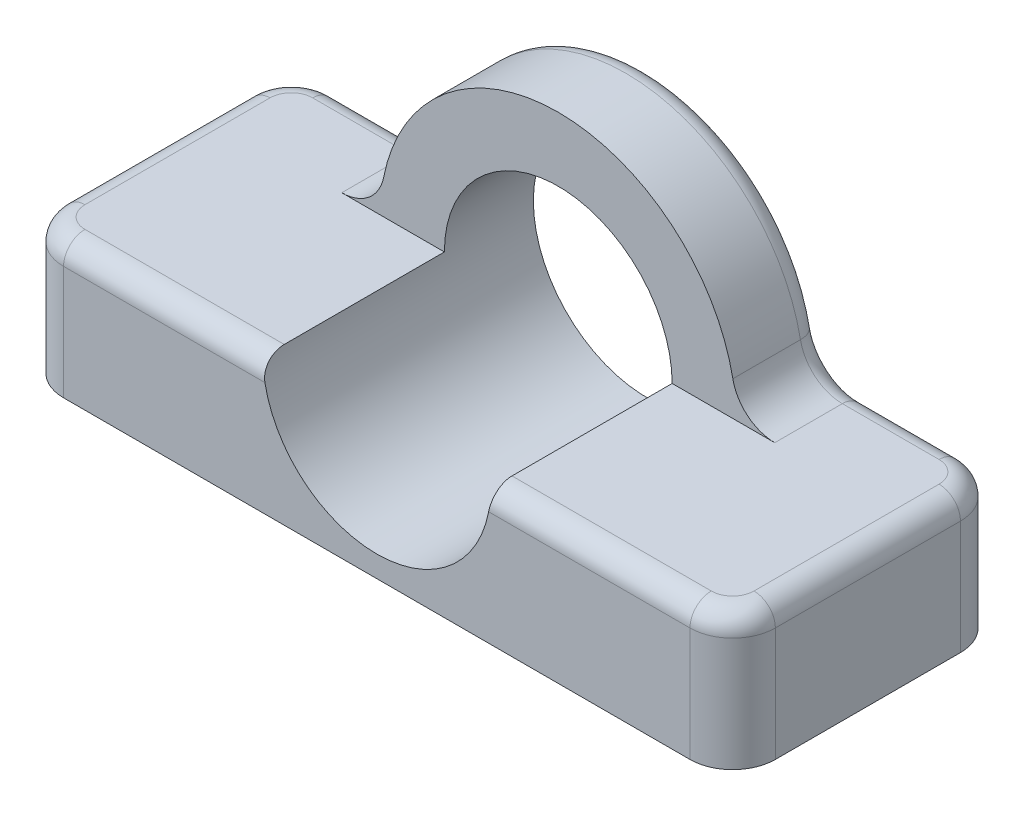
ISO-10303-21;
HEADER;
FILE_DESCRIPTION(('STEP AP214'),'2;1');
FILE_NAME('part.step','',(''),(''),'','','');
FILE_SCHEMA(('AUTOMOTIVE_DESIGN { 1 0 10303 214 1 1 1 1 }'));
ENDSEC;
DATA;
#1=APPLICATION_CONTEXT('core data for automotive mechanical design processes');
#2=APPLICATION_PROTOCOL_DEFINITION('international standard','automotive_design',2000,#1);
#3=PRODUCT_CONTEXT('',#1,'mechanical');
#4=PRODUCT('Part','Part','',(#3));
#5=PRODUCT_RELATED_PRODUCT_CATEGORY('part','',(#4));
#6=PRODUCT_DEFINITION_FORMATION('','',#4);
#7=PRODUCT_DEFINITION_CONTEXT('part definition',#1,'design');
#8=PRODUCT_DEFINITION('design','',#6,#7);
#9=PRODUCT_DEFINITION_SHAPE('','',#8);
#10=(LENGTH_UNIT() NAMED_UNIT(*) SI_UNIT(.MILLI.,.METRE.));
#11=(NAMED_UNIT(*) PLANE_ANGLE_UNIT() SI_UNIT($,.RADIAN.));
#12=(NAMED_UNIT(*) SI_UNIT($,.STERADIAN.) SOLID_ANGLE_UNIT());
#13=UNCERTAINTY_MEASURE_WITH_UNIT(LENGTH_MEASURE(1.E-05),#10,'distance_accuracy_value','');
#14=(GEOMETRIC_REPRESENTATION_CONTEXT(3) GLOBAL_UNCERTAINTY_ASSIGNED_CONTEXT((#13)) GLOBAL_UNIT_ASSIGNED_CONTEXT((#10,
#11,#12)) REPRESENTATION_CONTEXT('',''));
#15=CARTESIAN_POINT('',(0.,0.,0.));
#16=DIRECTION('',(0.,0.,1.));
#17=DIRECTION('',(1.,0.,0.));
#18=AXIS2_PLACEMENT_3D('',#15,#16,#17);
#19=CARTESIAN_POINT('',(0.,19.,-38.));
#20=DIRECTION('',(0.,-1.,0.));
#21=DIRECTION('',(0.,0.,-1.));
#22=AXIS2_PLACEMENT_3D('',#19,#20,#21);
#23=PLANE('',#22);
#24=DIRECTION('',(0.,0.,-1.));
#25=VECTOR('',#24,1.);
#26=CARTESIAN_POINT('',(19.5861873485089,19.,-38.));
#27=LINE('',#26,#25);
#28=CARTESIAN_POINT('',(19.5861873485089,19.,-25.5));
#29=VERTEX_POINT('',#28);
#30=CARTESIAN_POINT('',(19.5861873485089,19.,-35.));
#31=VERTEX_POINT('',#30);
#32=EDGE_CURVE('E240',#29,#31,#27,.T.);
#33=ORIENTED_EDGE('',*,*,#32,.T.);
#34=DIRECTION('',(-1.,0.,0.));
#35=VECTOR('',#34,1.);
#36=CARTESIAN_POINT('',(0.,19.,-35.));
#37=LINE('',#36,#35);
#38=CARTESIAN_POINT('',(6.,19.,-35.));
#39=VERTEX_POINT('',#38);
#40=EDGE_CURVE('E643',#31,#39,#37,.T.);
#41=ORIENTED_EDGE('',*,*,#40,.T.);
#42=CARTESIAN_POINT('',(6.,19.,-32.));
#43=DIRECTION('',(0.,-1.,0.));
#44=DIRECTION('',(0.,0.,-1.));
#45=AXIS2_PLACEMENT_3D('',#42,#43,#44);
#46=CIRCLE('',#45,3.);
#47=CARTESIAN_POINT('',(3.,19.,-32.));
#48=VERTEX_POINT('',#47);
#49=EDGE_CURVE('E645',#39,#48,#46,.F.);
#50=ORIENTED_EDGE('',*,*,#49,.T.);
#51=DIRECTION('',(0.,0.,1.));
#52=VECTOR('',#51,1.);
#53=CARTESIAN_POINT('',(3.,19.,-38.));
#54=LINE('',#53,#52);
#55=CARTESIAN_POINT('',(3.,19.,-6.));
#56=VERTEX_POINT('',#55);
#57=EDGE_CURVE('E647',#48,#56,#54,.T.);
#58=ORIENTED_EDGE('',*,*,#57,.T.);
#59=CARTESIAN_POINT('',(6.,19.,-6.));
#60=DIRECTION('',(0.,-1.,0.));
#61=DIRECTION('',(0.,0.,-1.));
#62=AXIS2_PLACEMENT_3D('',#59,#60,#61);
#63=CIRCLE('',#62,3.);
#64=CARTESIAN_POINT('',(6.,19.,-3.));
#65=VERTEX_POINT('',#64);
#66=EDGE_CURVE('E601',#56,#65,#63,.F.);
#67=ORIENTED_EDGE('',*,*,#66,.T.);
#68=DIRECTION('',(1.,0.,0.));
#69=VECTOR('',#68,1.);
#70=CARTESIAN_POINT('',(0.,19.,-3.));
#71=LINE('',#70,#69);
#72=CARTESIAN_POINT('',(34.,19.,-3.));
#73=VERTEX_POINT('',#72);
#74=EDGE_CURVE('E197',#65,#73,#71,.T.);
#75=ORIENTED_EDGE('',*,*,#74,.T.);
#76=DIRECTION('',(0.,0.,-1.));
#77=VECTOR('',#76,1.);
#78=CARTESIAN_POINT('',(34.,19.,0.));
#79=LINE('',#78,#77);
#80=CARTESIAN_POINT('',(34.,19.,-25.5));
#81=VERTEX_POINT('',#80);
#82=EDGE_CURVE('E190',#73,#81,#79,.T.);
#83=ORIENTED_EDGE('',*,*,#82,.T.);
#84=DIRECTION('',(-1.,0.,0.));
#85=VECTOR('',#84,1.);
#86=CARTESIAN_POINT('',(25.,19.,-25.5));
#87=LINE('',#86,#85);
#88=EDGE_CURVE('E194',#81,#29,#87,.T.);
#89=ORIENTED_EDGE('',*,*,#88,.T.);
#90=EDGE_LOOP('',(#33,#41,#50,#58,#67,#75,#83,#89));
#91=FACE_BOUND('',#90,.T.);
#92=ADVANCED_FACE('F46',(#91),#23,.F.);
#93=CARTESIAN_POINT('',(0.,19.,0.));
#94=DIRECTION('',(1.,0.,0.));
#95=DIRECTION('',(0.,0.,-1.));
#96=AXIS2_PLACEMENT_3D('',#93,#94,#95);
#97=PLANE('',#96);
#98=DIRECTION('',(0.,-1.,0.));
#99=VECTOR('',#98,1.);
#100=CARTESIAN_POINT('',(0.,19.,-6.));
#101=LINE('',#100,#99);
#102=CARTESIAN_POINT('',(0.,0.,-6.));
#103=VERTEX_POINT('',#102);
#104=CARTESIAN_POINT('',(0.,16.,-6.));
#105=VERTEX_POINT('',#104);
#106=EDGE_CURVE('E269',#103,#105,#101,.F.);
#107=ORIENTED_EDGE('',*,*,#106,.T.);
#108=DIRECTION('',(0.,0.,1.));
#109=VECTOR('',#108,1.);
#110=CARTESIAN_POINT('',(0.,16.,0.));
#111=LINE('',#110,#109);
#112=CARTESIAN_POINT('',(0.,16.,-32.));
#113=VERTEX_POINT('',#112);
#114=EDGE_CURVE('E56',#105,#113,#111,.F.);
#115=ORIENTED_EDGE('',*,*,#114,.T.);
#116=DIRECTION('',(0.,-1.,0.));
#117=VECTOR('',#116,1.);
#118=CARTESIAN_POINT('',(0.,19.,-32.));
#119=LINE('',#118,#117);
#120=CARTESIAN_POINT('',(0.,0.,-32.));
#121=VERTEX_POINT('',#120);
#122=EDGE_CURVE('E271',#113,#121,#119,.T.);
#123=ORIENTED_EDGE('',*,*,#122,.T.);
#124=DIRECTION('',(0.,0.,1.));
#125=VECTOR('',#124,1.);
#126=CARTESIAN_POINT('',(0.,0.,0.));
#127=LINE('',#126,#125);
#128=EDGE_CURVE('E220',#121,#103,#127,.T.);
#129=ORIENTED_EDGE('',*,*,#128,.T.);
#130=EDGE_LOOP('',(#107,#115,#123,#129));
#131=FACE_BOUND('',#130,.T.);
#132=ADVANCED_FACE('F335',(#131),#97,.F.);
#133=CARTESIAN_POINT('',(0.,19.,0.));
#134=DIRECTION('',(0.,0.,-1.));
#135=DIRECTION('',(-1.,0.,0.));
#136=AXIS2_PLACEMENT_3D('',#133,#134,#135);
#137=PLANE('',#136);
#138=DIRECTION('',(0.,-1.,0.));
#139=VECTOR('',#138,1.);
#140=CARTESIAN_POINT('',(94.,19.,0.));
#141=LINE('',#140,#139);
#142=CARTESIAN_POINT('',(94.,0.,0.));
#143=VERTEX_POINT('',#142);
#144=CARTESIAN_POINT('',(94.,16.,0.));
#145=VERTEX_POINT('',#144);
#146=EDGE_CURVE('E261',#143,#145,#141,.F.);
#147=ORIENTED_EDGE('',*,*,#146,.T.);
#148=DIRECTION('',(1.,0.,0.));
#149=VECTOR('',#148,1.);
#150=CARTESIAN_POINT('',(0.,16.,0.));
#151=LINE('',#150,#149);
#152=CARTESIAN_POINT('',(65.7162336455017,16.,0.));
#153=VERTEX_POINT('',#152);
#154=EDGE_CURVE('E286',#145,#153,#151,.F.);
#155=ORIENTED_EDGE('',*,*,#154,.T.);
#156=CARTESIAN_POINT('',(50.,19.,0.));
#157=DIRECTION('',(0.,0.,-1.));
#158=DIRECTION('',(-1.,0.,0.));
#159=AXIS2_PLACEMENT_3D('',#156,#157,#158);
#160=CIRCLE('',#159,16.);
#161=CARTESIAN_POINT('',(34.2837663544983,16.,0.));
#162=VERTEX_POINT('',#161);
#163=EDGE_CURVE('E607',#153,#162,#160,.T.);
#164=ORIENTED_EDGE('',*,*,#163,.T.);
#165=DIRECTION('',(1.,0.,0.));
#166=VECTOR('',#165,1.);
#167=CARTESIAN_POINT('',(0.,16.,0.));
#168=LINE('',#167,#166);
#169=CARTESIAN_POINT('',(6.,16.,0.));
#170=VERTEX_POINT('',#169);
#171=EDGE_CURVE('E284',#162,#170,#168,.F.);
#172=ORIENTED_EDGE('',*,*,#171,.T.);
#173=DIRECTION('',(0.,-1.,0.));
#174=VECTOR('',#173,1.);
#175=CARTESIAN_POINT('',(6.,19.,0.));
#176=LINE('',#175,#174);
#177=CARTESIAN_POINT('',(6.,0.,0.));
#178=VERTEX_POINT('',#177);
#179=EDGE_CURVE('E259',#170,#178,#176,.T.);
#180=ORIENTED_EDGE('',*,*,#179,.T.);
#181=DIRECTION('',(1.,0.,0.));
#182=VECTOR('',#181,1.);
#183=CARTESIAN_POINT('',(0.,0.,0.));
#184=LINE('',#183,#182);
#185=EDGE_CURVE('E226',#178,#143,#184,.T.);
#186=ORIENTED_EDGE('',*,*,#185,.T.);
#187=EDGE_LOOP('',(#147,#155,#164,#172,#180,#186));
#188=FACE_BOUND('',#187,.T.);
#189=ADVANCED_FACE('F331',(#188),#137,.F.);
#190=CARTESIAN_POINT('',(100.,19.,0.));
#191=DIRECTION('',(-1.,0.,0.));
#192=DIRECTION('',(0.,0.,1.));
#193=AXIS2_PLACEMENT_3D('',#190,#191,#192);
#194=PLANE('',#193);
#195=DIRECTION('',(0.,-1.,0.));
#196=VECTOR('',#195,1.);
#197=CARTESIAN_POINT('',(100.,19.,-32.));
#198=LINE('',#197,#196);
#199=CARTESIAN_POINT('',(100.,0.,-32.));
#200=VERTEX_POINT('',#199);
#201=CARTESIAN_POINT('',(100.,16.,-32.));
#202=VERTEX_POINT('',#201);
#203=EDGE_CURVE('E211',#200,#202,#198,.F.);
#204=ORIENTED_EDGE('',*,*,#203,.T.);
#205=DIRECTION('',(0.,0.,-1.));
#206=VECTOR('',#205,1.);
#207=CARTESIAN_POINT('',(100.,16.,0.));
#208=LINE('',#207,#206);
#209=CARTESIAN_POINT('',(100.,16.,-6.));
#210=VERTEX_POINT('',#209);
#211=EDGE_CURVE('E669',#202,#210,#208,.F.);
#212=ORIENTED_EDGE('',*,*,#211,.T.);
#213=DIRECTION('',(0.,-1.,0.));
#214=VECTOR('',#213,1.);
#215=CARTESIAN_POINT('',(100.,19.,-6.));
#216=LINE('',#215,#214);
#217=CARTESIAN_POINT('',(100.,0.,-6.));
#218=VERTEX_POINT('',#217);
#219=EDGE_CURVE('E249',#210,#218,#216,.T.);
#220=ORIENTED_EDGE('',*,*,#219,.T.);
#221=DIRECTION('',(0.,0.,-1.));
#222=VECTOR('',#221,1.);
#223=CARTESIAN_POINT('',(100.,0.,0.));
#224=LINE('',#223,#222);
#225=EDGE_CURVE('E229',#218,#200,#224,.T.);
#226=ORIENTED_EDGE('',*,*,#225,.T.);
#227=EDGE_LOOP('',(#204,#212,#220,#226));
#228=FACE_BOUND('',#227,.T.);
#229=ADVANCED_FACE('F327',(#228),#194,.F.);
#230=CARTESIAN_POINT('',(0.,19.,-38.));
#231=DIRECTION('',(0.,0.,1.));
#232=DIRECTION('',(1.,0.,0.));
#233=AXIS2_PLACEMENT_3D('',#230,#231,#232);
#234=PLANE('',#233);
#235=CARTESIAN_POINT('',(50.,19.,-38.));
#236=DIRECTION('',(0.,0.,-1.));
#237=DIRECTION('',(-1.,0.,0.));
#238=AXIS2_PLACEMENT_3D('',#235,#236,#237);
#239=CIRCLE('',#238,16.);
#240=CARTESIAN_POINT('',(34.,19.,-38.));
#241=VERTEX_POINT('',#240);
#242=EDGE_CURVE('E604',#241,#241,#239,.T.);
#243=ORIENTED_EDGE('',*,*,#242,.F.);
#244=EDGE_LOOP('',(#243));
#245=FACE_BOUND('',#244,.T.);
#246=CARTESIAN_POINT('',(80.4138126514911,25.,-38.));
#247=DIRECTION('',(0.,0.,1.));
#248=DIRECTION('',(1.,0.,0.));
#249=AXIS2_PLACEMENT_3D('',#246,#247,#248);
#250=CIRCLE('',#249,9.);
#251=CARTESIAN_POINT('',(71.5839960752518,23.258064516129,-38.));
#252=VERTEX_POINT('',#251);
#253=CARTESIAN_POINT('',(80.4138126514911,16.,-38.));
#254=VERTEX_POINT('',#253);
#255=EDGE_CURVE('E659',#252,#254,#250,.T.);
#256=ORIENTED_EDGE('',*,*,#255,.T.);
#257=DIRECTION('',(-1.,0.,0.));
#258=VECTOR('',#257,1.);
#259=CARTESIAN_POINT('',(0.,16.,-38.));
#260=LINE('',#259,#258);
#261=CARTESIAN_POINT('',(94.,16.,-38.));
#262=VERTEX_POINT('',#261);
#263=EDGE_CURVE('E657',#254,#262,#260,.F.);
#264=ORIENTED_EDGE('',*,*,#263,.T.);
#265=DIRECTION('',(0.,-1.,0.));
#266=VECTOR('',#265,1.);
#267=CARTESIAN_POINT('',(94.,19.,-38.));
#268=LINE('',#267,#266);
#269=CARTESIAN_POINT('',(94.,0.,-38.));
#270=VERTEX_POINT('',#269);
#271=EDGE_CURVE('E267',#262,#270,#268,.T.);
#272=ORIENTED_EDGE('',*,*,#271,.T.);
#273=DIRECTION('',(-1.,0.,0.));
#274=VECTOR('',#273,1.);
#275=CARTESIAN_POINT('',(0.,0.,-38.));
#276=LINE('',#275,#274);
#277=CARTESIAN_POINT('',(6.,0.,-38.));
#278=VERTEX_POINT('',#277);
#279=EDGE_CURVE('E232',#270,#278,#276,.T.);
#280=ORIENTED_EDGE('',*,*,#279,.T.);
#281=DIRECTION('',(0.,-1.,0.));
#282=VECTOR('',#281,1.);
#283=CARTESIAN_POINT('',(6.,19.,-38.));
#284=LINE('',#283,#282);
#285=CARTESIAN_POINT('',(6.,16.,-38.));
#286=VERTEX_POINT('',#285);
#287=EDGE_CURVE('E264',#278,#286,#284,.F.);
#288=ORIENTED_EDGE('',*,*,#287,.T.);
#289=DIRECTION('',(-1.,0.,0.));
#290=VECTOR('',#289,1.);
#291=CARTESIAN_POINT('',(0.,16.,-38.));
#292=LINE('',#291,#290);
#293=CARTESIAN_POINT('',(19.5861873485089,16.,-38.));
#294=VERTEX_POINT('',#293);
#295=EDGE_CURVE('E665',#286,#294,#292,.F.);
#296=ORIENTED_EDGE('',*,*,#295,.T.);
#297=CARTESIAN_POINT('',(19.5861873485089,25.,-38.));
#298=DIRECTION('',(0.,0.,1.));
#299=DIRECTION('',(1.,0.,0.));
#300=AXIS2_PLACEMENT_3D('',#297,#298,#299);
#301=CIRCLE('',#300,9.);
#302=CARTESIAN_POINT('',(28.4160039247482,23.258064516129,-38.));
#303=VERTEX_POINT('',#302);
#304=EDGE_CURVE('E663',#294,#303,#301,.T.);
#305=ORIENTED_EDGE('',*,*,#304,.T.);
#306=CARTESIAN_POINT('',(50.,19.,-38.));
#307=DIRECTION('',(0.,0.,1.));
#308=DIRECTION('',(1.,0.,0.));
#309=AXIS2_PLACEMENT_3D('',#306,#307,#308);
#310=CIRCLE('',#309,22.);
#311=EDGE_CURVE('E661',#303,#252,#310,.F.);
#312=ORIENTED_EDGE('',*,*,#311,.T.);
#313=EDGE_LOOP('',(#256,#264,#272,#280,#288,#296,#305,#312));
#314=FACE_BOUND('',#313,.T.);
#315=ADVANCED_FACE('F320',(#245,#314),#234,.F.);
#316=DIRECTION('',(0.,0.,-1.));
#317=VECTOR('',#316,1.);
#318=CARTESIAN_POINT('',(66.,19.,0.));
#319=LINE('',#318,#317);
#320=CARTESIAN_POINT('',(66.,19.,-25.5));
#321=VERTEX_POINT('',#320);
#322=CARTESIAN_POINT('',(66.,19.,-3.));
#323=VERTEX_POINT('',#322);
#324=EDGE_CURVE('E201',#321,#323,#319,.F.);
#325=ORIENTED_EDGE('',*,*,#324,.T.);
#326=DIRECTION('',(1.,0.,0.));
#327=VECTOR('',#326,1.);
#328=CARTESIAN_POINT('',(0.,19.,-3.));
#329=LINE('',#328,#327);
#330=CARTESIAN_POINT('',(94.,19.,-3.));
#331=VERTEX_POINT('',#330);
#332=EDGE_CURVE('E281',#323,#331,#329,.T.);
#333=ORIENTED_EDGE('',*,*,#332,.T.);
#334=CARTESIAN_POINT('',(94.,19.,-6.));
#335=DIRECTION('',(0.,-1.,0.));
#336=DIRECTION('',(0.,0.,-1.));
#337=AXIS2_PLACEMENT_3D('',#334,#335,#336);
#338=CIRCLE('',#337,3.);
#339=CARTESIAN_POINT('',(97.,19.,-6.));
#340=VERTEX_POINT('',#339);
#341=EDGE_CURVE('E279',#331,#340,#338,.F.);
#342=ORIENTED_EDGE('',*,*,#341,.T.);
#343=DIRECTION('',(0.,0.,-1.));
#344=VECTOR('',#343,1.);
#345=CARTESIAN_POINT('',(97.,19.,-38.));
#346=LINE('',#345,#344);
#347=CARTESIAN_POINT('',(97.,19.,-32.));
#348=VERTEX_POINT('',#347);
#349=EDGE_CURVE('E277',#340,#348,#346,.T.);
#350=ORIENTED_EDGE('',*,*,#349,.T.);
#351=CARTESIAN_POINT('',(94.,19.,-32.));
#352=DIRECTION('',(0.,-1.,0.));
#353=DIRECTION('',(0.,0.,-1.));
#354=AXIS2_PLACEMENT_3D('',#351,#352,#353);
#355=CIRCLE('',#354,3.);
#356=CARTESIAN_POINT('',(94.,19.,-35.));
#357=VERTEX_POINT('',#356);
#358=EDGE_CURVE('E275',#348,#357,#355,.F.);
#359=ORIENTED_EDGE('',*,*,#358,.T.);
#360=DIRECTION('',(-1.,0.,0.));
#361=VECTOR('',#360,1.);
#362=CARTESIAN_POINT('',(0.,19.,-35.));
#363=LINE('',#362,#361);
#364=CARTESIAN_POINT('',(80.4138126514911,19.,-35.));
#365=VERTEX_POINT('',#364);
#366=EDGE_CURVE('E273',#357,#365,#363,.T.);
#367=ORIENTED_EDGE('',*,*,#366,.T.);
#368=DIRECTION('',(0.,0.,-1.));
#369=VECTOR('',#368,1.);
#370=CARTESIAN_POINT('',(80.4138126514911,19.,-38.));
#371=LINE('',#370,#369);
#372=CARTESIAN_POINT('',(80.4138126514911,19.,-25.5));
#373=VERTEX_POINT('',#372);
#374=EDGE_CURVE('E242',#365,#373,#371,.F.);
#375=ORIENTED_EDGE('',*,*,#374,.T.);
#376=EDGE_CURVE('E218',#373,#321,#87,.T.);
#377=ORIENTED_EDGE('',*,*,#376,.T.);
#378=EDGE_LOOP('',(#325,#333,#342,#350,#359,#367,#375,#377));
#379=FACE_BOUND('',#378,.T.);
#380=ADVANCED_FACE('F317',(#379),#23,.F.);
#381=CARTESIAN_POINT('',(0.,0.,-38.));
#382=DIRECTION('',(0.,-1.,0.));
#383=DIRECTION('',(0.,0.,-1.));
#384=AXIS2_PLACEMENT_3D('',#381,#382,#383);
#385=PLANE('',#384);
#386=ORIENTED_EDGE('',*,*,#225,.F.);
#387=CARTESIAN_POINT('',(94.,0.,-6.));
#388=DIRECTION('',(0.,-1.,0.));
#389=DIRECTION('',(0.,0.,-1.));
#390=AXIS2_PLACEMENT_3D('',#387,#388,#389);
#391=CIRCLE('',#390,6.);
#392=EDGE_CURVE('E257',#218,#143,#391,.T.);
#393=ORIENTED_EDGE('',*,*,#392,.T.);
#394=ORIENTED_EDGE('',*,*,#185,.F.);
#395=CARTESIAN_POINT('',(6.,0.,-6.));
#396=DIRECTION('',(0.,-1.,0.));
#397=DIRECTION('',(0.,0.,-1.));
#398=AXIS2_PLACEMENT_3D('',#395,#396,#397);
#399=CIRCLE('',#398,6.);
#400=EDGE_CURVE('E251',#178,#103,#399,.T.);
#401=ORIENTED_EDGE('',*,*,#400,.T.);
#402=ORIENTED_EDGE('',*,*,#128,.F.);
#403=CARTESIAN_POINT('',(6.,0.,-32.));
#404=DIRECTION('',(0.,-1.,0.));
#405=DIRECTION('',(0.,0.,-1.));
#406=AXIS2_PLACEMENT_3D('',#403,#404,#405);
#407=CIRCLE('',#406,6.);
#408=EDGE_CURVE('E253',#121,#278,#407,.T.);
#409=ORIENTED_EDGE('',*,*,#408,.T.);
#410=ORIENTED_EDGE('',*,*,#279,.F.);
#411=CARTESIAN_POINT('',(94.,0.,-32.));
#412=DIRECTION('',(0.,-1.,0.));
#413=DIRECTION('',(0.,0.,-1.));
#414=AXIS2_PLACEMENT_3D('',#411,#412,#413);
#415=CIRCLE('',#414,6.);
#416=EDGE_CURVE('E255',#270,#200,#415,.T.);
#417=ORIENTED_EDGE('',*,*,#416,.T.);
#418=EDGE_LOOP('',(#386,#393,#394,#401,#402,#409,#410,#417));
#419=FACE_BOUND('',#418,.T.);
#420=ADVANCED_FACE('F315',(#419),#385,.T.);
#421=CARTESIAN_POINT('',(50.,19.,-25.5));
#422=DIRECTION('',(0.,0.,-1.));
#423=DIRECTION('',(-1.,0.,0.));
#424=AXIS2_PLACEMENT_3D('',#421,#422,#423);
#425=CYLINDRICAL_SURFACE('',#424,25.);
#426=DIRECTION('',(0.,0.,-1.));
#427=VECTOR('',#426,1.);
#428=CARTESIAN_POINT('',(74.5272682673315,23.8387096774194,-25.5));
#429=LINE('',#428,#427);
#430=CARTESIAN_POINT('',(74.5272682673315,23.8387096774194,-25.5));
#431=VERTEX_POINT('',#430);
#432=CARTESIAN_POINT('',(74.5272682673315,23.8387096774194,-35.));
#433=VERTEX_POINT('',#432);
#434=EDGE_CURVE('E237',#431,#433,#429,.T.);
#435=ORIENTED_EDGE('',*,*,#434,.T.);
#436=CARTESIAN_POINT('',(50.,19.,-35.));
#437=DIRECTION('',(0.,0.,1.));
#438=DIRECTION('',(1.,0.,0.));
#439=AXIS2_PLACEMENT_3D('',#436,#437,#438);
#440=CIRCLE('',#439,25.);
#441=CARTESIAN_POINT('',(25.4727317326685,23.8387096774194,-35.));
#442=VERTEX_POINT('',#441);
#443=EDGE_CURVE('E653',#433,#442,#440,.T.);
#444=ORIENTED_EDGE('',*,*,#443,.T.);
#445=DIRECTION('',(0.,0.,-1.));
#446=VECTOR('',#445,1.);
#447=CARTESIAN_POINT('',(25.4727317326685,23.8387096774194,-25.5));
#448=LINE('',#447,#446);
#449=CARTESIAN_POINT('',(25.4727317326685,23.8387096774194,-25.5));
#450=VERTEX_POINT('',#449);
#451=EDGE_CURVE('E235',#442,#450,#448,.F.);
#452=ORIENTED_EDGE('',*,*,#451,.T.);
#453=CARTESIAN_POINT('',(50.,19.,-25.5));
#454=DIRECTION('',(0.,0.,-1.));
#455=DIRECTION('',(1.,0.,0.));
#456=AXIS2_PLACEMENT_3D('',#453,#454,#455);
#457=CIRCLE('',#456,25.);
#458=EDGE_CURVE('E200',#450,#431,#457,.T.);
#459=ORIENTED_EDGE('',*,*,#458,.T.);
#460=EDGE_LOOP('',(#435,#444,#452,#459));
#461=FACE_BOUND('',#460,.T.);
#462=ADVANCED_FACE('F312',(#461),#425,.T.);
#463=CARTESIAN_POINT('',(50.,19.,-25.5));
#464=DIRECTION('',(0.,0.,1.));
#465=DIRECTION('',(1.,0.,0.));
#466=AXIS2_PLACEMENT_3D('',#463,#464,#465);
#467=PLANE('',#466);
#468=CARTESIAN_POINT('',(50.,19.,-25.5));
#469=DIRECTION('',(0.,0.,1.));
#470=DIRECTION('',(1.,0.,0.));
#471=AXIS2_PLACEMENT_3D('',#468,#469,#470);
#472=CIRCLE('',#471,16.);
#473=EDGE_CURVE('E204',#321,#81,#472,.T.);
#474=ORIENTED_EDGE('',*,*,#473,.F.);
#475=ORIENTED_EDGE('',*,*,#376,.F.);
#476=CARTESIAN_POINT('',(80.4138126514911,25.,-25.5));
#477=DIRECTION('',(0.,0.,1.));
#478=DIRECTION('',(1.,0.,0.));
#479=AXIS2_PLACEMENT_3D('',#476,#477,#478);
#480=CIRCLE('',#479,6.);
#481=EDGE_CURVE('E244',#373,#431,#480,.F.);
#482=ORIENTED_EDGE('',*,*,#481,.T.);
#483=ORIENTED_EDGE('',*,*,#458,.F.);
#484=CARTESIAN_POINT('',(19.5861873485089,25.,-25.5));
#485=DIRECTION('',(0.,0.,1.));
#486=DIRECTION('',(1.,0.,0.));
#487=AXIS2_PLACEMENT_3D('',#484,#485,#486);
#488=CIRCLE('',#487,6.);
#489=EDGE_CURVE('E212',#450,#29,#488,.F.);
#490=ORIENTED_EDGE('',*,*,#489,.T.);
#491=ORIENTED_EDGE('',*,*,#88,.F.);
#492=EDGE_LOOP('',(#474,#475,#482,#483,#490,#491));
#493=FACE_BOUND('',#492,.T.);
#494=ADVANCED_FACE('F214',(#493),#467,.T.);
#495=CARTESIAN_POINT('',(80.4138126514911,25.,-25.5));
#496=DIRECTION('',(0.,0.,-1.));
#497=DIRECTION('',(-1.,0.,0.));
#498=AXIS2_PLACEMENT_3D('',#495,#496,#497);
#499=CYLINDRICAL_SURFACE('',#498,6.);
#500=ORIENTED_EDGE('',*,*,#374,.F.);
#501=CARTESIAN_POINT('',(80.4138126514911,25.,-35.));
#502=DIRECTION('',(0.,0.,1.));
#503=DIRECTION('',(1.,0.,0.));
#504=AXIS2_PLACEMENT_3D('',#501,#502,#503);
#505=CIRCLE('',#504,6.);
#506=EDGE_CURVE('E655',#365,#433,#505,.F.);
#507=ORIENTED_EDGE('',*,*,#506,.T.);
#508=ORIENTED_EDGE('',*,*,#434,.F.);
#509=ORIENTED_EDGE('',*,*,#481,.F.);
#510=EDGE_LOOP('',(#500,#507,#508,#509));
#511=FACE_BOUND('',#510,.T.);
#512=ADVANCED_FACE('F311',(#511),#499,.F.);
#513=CARTESIAN_POINT('',(19.5861873485089,25.,-25.5));
#514=DIRECTION('',(0.,0.,-1.));
#515=DIRECTION('',(-1.,0.,0.));
#516=AXIS2_PLACEMENT_3D('',#513,#514,#515);
#517=CYLINDRICAL_SURFACE('',#516,6.);
#518=ORIENTED_EDGE('',*,*,#451,.F.);
#519=CARTESIAN_POINT('',(19.5861873485089,25.,-35.));
#520=DIRECTION('',(0.,0.,1.));
#521=DIRECTION('',(1.,0.,0.));
#522=AXIS2_PLACEMENT_3D('',#519,#520,#521);
#523=CIRCLE('',#522,6.);
#524=EDGE_CURVE('E651',#442,#31,#523,.F.);
#525=ORIENTED_EDGE('',*,*,#524,.T.);
#526=ORIENTED_EDGE('',*,*,#32,.F.);
#527=ORIENTED_EDGE('',*,*,#489,.F.);
#528=EDGE_LOOP('',(#518,#525,#526,#527));
#529=FACE_BOUND('',#528,.T.);
#530=ADVANCED_FACE('F306',(#529),#517,.F.);
#531=CARTESIAN_POINT('',(50.,19.,0.));
#532=DIRECTION('',(0.,0.,-1.));
#533=DIRECTION('',(-1.,0.,0.));
#534=AXIS2_PLACEMENT_3D('',#531,#532,#533);
#535=CYLINDRICAL_SURFACE('',#534,16.);
#536=ORIENTED_EDGE('',*,*,#242,.T.);
#537=EDGE_LOOP('',(#536));
#538=FACE_BOUND('',#537,.T.);
#539=ORIENTED_EDGE('',*,*,#163,.F.);
#540=CARTESIAN_POINT('',(65.7162336455017,16.,0.));
#541=CARTESIAN_POINT('',(65.732034466509,16.0827432024955,8.36038180069745E-06));
#542=CARTESIAN_POINT('',(65.747169890216,16.1656144768698,-0.00342332220623208));
#543=CARTESIAN_POINT('',(65.7760456912072,16.3310338715836,-0.0171669730935823));
#544=CARTESIAN_POINT('',(65.7897859785404,16.4135819707571,-0.0274793847020571));
#545=CARTESIAN_POINT('',(65.8157987227503,16.5777240195734,-0.0549778451980962));
#546=CARTESIAN_POINT('',(65.828071907244,16.6593184239374,-0.0721604682440407));
#547=CARTESIAN_POINT('',(65.8511351072759,16.820964446647,-0.113309230687009));
#548=CARTESIAN_POINT('',(65.861925194042,16.9010161389247,-0.137275044142166));
#549=CARTESIAN_POINT('',(65.8920971844682,17.1381379627197,-0.219252234349214));
#550=CARTESIAN_POINT('',(65.9092766081627,17.2921479085826,-0.287338858557886));
#551=CARTESIAN_POINT('',(65.938163350817,17.586863786749,-0.448509582838106));
#552=CARTESIAN_POINT('',(65.9498726196673,17.727574445425,-0.541584756837558));
#553=CARTESIAN_POINT('',(65.9686553311134,17.9904144610352,-0.749215621759194));
#554=CARTESIAN_POINT('',(65.9757700120338,18.1127013350732,-0.863568017402116));
#555=CARTESIAN_POINT('',(65.9866380629841,18.3366632877898,-1.11111777661345));
#556=CARTESIAN_POINT('',(65.9903905460745,18.4383329222224,-1.24432010202238));
#557=CARTESIAN_POINT('',(65.9957066273929,18.6184873657223,-1.5263503875638));
#558=CARTESIAN_POINT('',(65.9972614326445,18.6968780532235,-1.67523857066686));
#559=CARTESIAN_POINT('',(65.9992064716056,18.8276835922042,-1.98398834041405));
#560=CARTESIAN_POINT('',(65.9995972876879,18.8801114225981,-2.14384439858444));
#561=CARTESIAN_POINT('',(65.9999311489635,18.9457894504438,-2.42038074769937));
#562=CARTESIAN_POINT('',(65.9999741119775,18.9661014531203,-2.53543549860626));
#563=CARTESIAN_POINT('',(66.0000000232366,18.9932083500472,-2.76697821563476));
#564=CARTESIAN_POINT('',(65.9999830473693,19.0000203193761,-2.88346418354481));
#565=CARTESIAN_POINT('',(66.,19.,-3.));
#566=B_SPLINE_CURVE_WITH_KNOTS('',3,(#540,#541,#542,#543,#544,#545,#546,#547,#548,#549,#550,
#551,#552,#553,#554,#555,#556,#557,#558,#559,#560,#561,#562,#563,#564,#565),.UNSPECIFIED.,.F.,
.F.,(4,2,2,2,2,2,2,2,2,2,2,2,4),(0.,0.252642689406562,0.505301657558215,0.75783479373573,
1.01035579739935,1.51547963577938,2.02042328016123,2.52076943128193,3.02124753365192,
3.52372245025316,4.02594592384432,4.37570090362117,4.72501322412568),.UNSPECIFIED.);
#567=EDGE_CURVE('E295',#153,#323,#566,.T.);
#568=ORIENTED_EDGE('',*,*,#567,.T.);
#569=ORIENTED_EDGE('',*,*,#324,.F.);
#570=ORIENTED_EDGE('',*,*,#473,.T.);
#571=ORIENTED_EDGE('',*,*,#82,.F.);
#572=CARTESIAN_POINT('',(34.,19.,-3.));
#573=CARTESIAN_POINT('',(34.0000049653986,19.0000080703694,-2.91564948868243));
#574=CARTESIAN_POINT('',(34.0000001295573,18.9964425231646,-2.83130281141234));
#575=CARTESIAN_POINT('',(34.0000069796999,18.9822266543419,-2.66321240437187));
#576=CARTESIAN_POINT('',(34.0000186649157,18.9715766620718,-2.57946864675538));
#577=CARTESIAN_POINT('',(34.0000946488269,18.9432641882483,-2.41322915471743));
#578=CARTESIAN_POINT('',(34.0001589109755,18.9256065821492,-2.33073259391287));
#579=CARTESIAN_POINT('',(34.0004109383259,18.8834221295621,-2.1675399253951));
#580=CARTESIAN_POINT('',(34.0005987020169,18.8588953671122,-2.08684379566823));
#581=CARTESIAN_POINT('',(34.0014802746132,18.7752083581516,-1.84823140110138));
#582=CARTESIAN_POINT('',(34.0024922650084,18.7059303645275,-1.69372673660812));
#583=CARTESIAN_POINT('',(34.0063353214573,18.5424795718676,-1.39866374240218));
#584=CARTESIAN_POINT('',(34.0091660766447,18.4483110287842,-1.25810303410417));
#585=CARTESIAN_POINT('',(34.0178138714772,18.2379200142144,-0.99499975260781));
#586=CARTESIAN_POINT('',(34.0236264944811,18.1217303197508,-0.8724308748856));
#587=CARTESIAN_POINT('',(34.0394152973695,17.8706092488652,-0.648593263499689));
#588=CARTESIAN_POINT('',(34.04939168047,17.7356769579088,-0.547325569821903));
#589=CARTESIAN_POINT('',(34.0744297525561,17.4519857699586,-0.369485742427332));
#590=CARTESIAN_POINT('',(34.0894607587463,17.3033141318525,-0.292769930120395));
#591=CARTESIAN_POINT('',(34.1252562963222,16.9959037551388,-0.165245125056868));
#592=CARTESIAN_POINT('',(34.1460188513853,16.8371685011222,-0.114427219479034));
#593=CARTESIAN_POINT('',(34.1860323275385,16.5646183723991,-0.0513962963769405));
#594=CARTESIAN_POINT('',(34.2037509729041,16.4521590245131,-0.0320958807552505));
#595=CARTESIAN_POINT('',(34.2418162431499,16.226396503682,-0.00639740059176914));
#596=CARTESIAN_POINT('',(34.2621587249623,16.1130949209184,2.07460817245127E-05));
#597=CARTESIAN_POINT('',(34.2837663544983,16.,0.));
#598=B_SPLINE_CURVE_WITH_KNOTS('',3,(#572,#573,#574,#575,#576,#577,#578,#579,#580,#581,#582,
#583,#584,#585,#586,#587,#588,#589,#590,#591,#592,#593,#594,#595,#596,#597),.UNSPECIFIED.,.F.,
.F.,(4,2,2,2,2,2,2,2,2,2,2,2,4),(0.,0.252969284235077,0.505926809038533,0.758708649669379,
1.01148739786906,1.51685136869899,2.02212898485514,2.52666035259995,3.03121634732274,
3.53276324976633,4.03413742698443,4.37983866874164,4.72500057797265),.UNSPECIFIED.);
#599=EDGE_CURVE('E288',#73,#162,#598,.T.);
#600=ORIENTED_EDGE('',*,*,#599,.T.);
#601=EDGE_LOOP('',(#539,#568,#569,#570,#571,#600));
#602=FACE_BOUND('',#601,.T.);
#603=ADVANCED_FACE('F206',(#538,#602),#535,.F.);
#604=CARTESIAN_POINT('',(94.,19.,-6.));
#605=DIRECTION('',(0.,-1.,0.));
#606=DIRECTION('',(0.,0.,-1.));
#607=AXIS2_PLACEMENT_3D('',#604,#605,#606);
#608=CYLINDRICAL_SURFACE('',#607,6.);
#609=ORIENTED_EDGE('',*,*,#219,.F.);
#610=CARTESIAN_POINT('',(94.,16.,-6.));
#611=DIRECTION('',(0.,-1.,0.));
#612=DIRECTION('',(0.,0.,-1.));
#613=AXIS2_PLACEMENT_3D('',#610,#611,#612);
#614=CIRCLE('',#613,6.);
#615=EDGE_CURVE('E670',#210,#145,#614,.T.);
#616=ORIENTED_EDGE('',*,*,#615,.T.);
#617=ORIENTED_EDGE('',*,*,#146,.F.);
#618=ORIENTED_EDGE('',*,*,#392,.F.);
#619=EDGE_LOOP('',(#609,#616,#617,#618));
#620=FACE_BOUND('',#619,.T.);
#621=ADVANCED_FACE('F305',(#620),#608,.T.);
#622=CARTESIAN_POINT('',(94.,19.,-32.));
#623=DIRECTION('',(0.,-1.,0.));
#624=DIRECTION('',(0.,0.,-1.));
#625=AXIS2_PLACEMENT_3D('',#622,#623,#624);
#626=CYLINDRICAL_SURFACE('',#625,6.);
#627=ORIENTED_EDGE('',*,*,#271,.F.);
#628=CARTESIAN_POINT('',(94.,16.,-32.));
#629=DIRECTION('',(0.,-1.,0.));
#630=DIRECTION('',(0.,0.,-1.));
#631=AXIS2_PLACEMENT_3D('',#628,#629,#630);
#632=CIRCLE('',#631,6.);
#633=EDGE_CURVE('E667',#262,#202,#632,.T.);
#634=ORIENTED_EDGE('',*,*,#633,.T.);
#635=ORIENTED_EDGE('',*,*,#203,.F.);
#636=ORIENTED_EDGE('',*,*,#416,.F.);
#637=EDGE_LOOP('',(#627,#634,#635,#636));
#638=FACE_BOUND('',#637,.T.);
#639=ADVANCED_FACE('F347',(#638),#626,.T.);
#640=CARTESIAN_POINT('',(6.,19.,-32.));
#641=DIRECTION('',(0.,-1.,0.));
#642=DIRECTION('',(0.,0.,-1.));
#643=AXIS2_PLACEMENT_3D('',#640,#641,#642);
#644=CYLINDRICAL_SURFACE('',#643,6.);
#645=ORIENTED_EDGE('',*,*,#122,.F.);
#646=CARTESIAN_POINT('',(6.,16.,-32.));
#647=DIRECTION('',(0.,-1.,0.));
#648=DIRECTION('',(0.,0.,-1.));
#649=AXIS2_PLACEMENT_3D('',#646,#647,#648);
#650=CIRCLE('',#649,6.);
#651=EDGE_CURVE('E641',#113,#286,#650,.T.);
#652=ORIENTED_EDGE('',*,*,#651,.T.);
#653=ORIENTED_EDGE('',*,*,#287,.F.);
#654=ORIENTED_EDGE('',*,*,#408,.F.);
#655=EDGE_LOOP('',(#645,#652,#653,#654));
#656=FACE_BOUND('',#655,.T.);
#657=ADVANCED_FACE('F351',(#656),#644,.T.);
#658=CARTESIAN_POINT('',(6.,19.,-6.));
#659=DIRECTION('',(0.,-1.,0.));
#660=DIRECTION('',(0.,0.,-1.));
#661=AXIS2_PLACEMENT_3D('',#658,#659,#660);
#662=CYLINDRICAL_SURFACE('',#661,6.);
#663=ORIENTED_EDGE('',*,*,#179,.F.);
#664=CARTESIAN_POINT('',(6.,16.,-6.));
#665=DIRECTION('',(0.,-1.,0.));
#666=DIRECTION('',(0.,0.,-1.));
#667=AXIS2_PLACEMENT_3D('',#664,#665,#666);
#668=CIRCLE('',#667,6.);
#669=EDGE_CURVE('E13',#170,#105,#668,.T.);
#670=ORIENTED_EDGE('',*,*,#669,.T.);
#671=ORIENTED_EDGE('',*,*,#106,.F.);
#672=ORIENTED_EDGE('',*,*,#400,.F.);
#673=EDGE_LOOP('',(#663,#670,#671,#672));
#674=FACE_BOUND('',#673,.T.);
#675=ADVANCED_FACE('F355',(#674),#662,.T.);
#676=CARTESIAN_POINT('',(0.,16.,-3.));
#677=DIRECTION('',(1.,0.,0.));
#678=DIRECTION('',(0.,0.,-1.));
#679=AXIS2_PLACEMENT_3D('',#676,#677,#678);
#680=CYLINDRICAL_SURFACE('',#679,3.);
#681=ORIENTED_EDGE('',*,*,#599,.F.);
#682=ORIENTED_EDGE('',*,*,#74,.F.);
#683=CARTESIAN_POINT('',(6.,16.,-3.));
#684=DIRECTION('',(-1.,0.,0.));
#685=DIRECTION('',(0.,0.,1.));
#686=AXIS2_PLACEMENT_3D('',#683,#684,#685);
#687=CIRCLE('',#686,3.);
#688=EDGE_CURVE('E51',#170,#65,#687,.T.);
#689=ORIENTED_EDGE('',*,*,#688,.F.);
#690=ORIENTED_EDGE('',*,*,#171,.F.);
#691=EDGE_LOOP('',(#681,#682,#689,#690));
#692=FACE_BOUND('',#691,.T.);
#693=ADVANCED_FACE('F48',(#692),#680,.T.);
#694=CARTESIAN_POINT('',(6.,16.,-6.));
#695=DIRECTION('',(0.,-1.,0.));
#696=DIRECTION('',(0.,0.,-1.));
#697=AXIS2_PLACEMENT_3D('',#694,#695,#696);
#698=DEGENERATE_TOROIDAL_SURFACE('',#697,3.,3.,.T.);
#699=ORIENTED_EDGE('',*,*,#688,.T.);
#700=ORIENTED_EDGE('',*,*,#66,.F.);
#701=CARTESIAN_POINT('',(3.,16.,-6.));
#702=DIRECTION('',(0.,0.,-1.));
#703=DIRECTION('',(-1.,0.,0.));
#704=AXIS2_PLACEMENT_3D('',#701,#702,#703);
#705=CIRCLE('',#704,3.);
#706=EDGE_CURVE('E605',#105,#56,#705,.T.);
#707=ORIENTED_EDGE('',*,*,#706,.F.);
#708=ORIENTED_EDGE('',*,*,#669,.F.);
#709=EDGE_LOOP('',(#699,#700,#707,#708));
#710=FACE_BOUND('',#709,.T.);
#711=ADVANCED_FACE('F401',(#710),#698,.T.);
#712=CARTESIAN_POINT('',(3.,16.,-38.));
#713=DIRECTION('',(0.,0.,1.));
#714=DIRECTION('',(1.,0.,0.));
#715=AXIS2_PLACEMENT_3D('',#712,#713,#714);
#716=CYLINDRICAL_SURFACE('',#715,3.);
#717=ORIENTED_EDGE('',*,*,#706,.T.);
#718=ORIENTED_EDGE('',*,*,#57,.F.);
#719=CARTESIAN_POINT('',(3.,16.,-32.));
#720=DIRECTION('',(0.,0.,-1.));
#721=DIRECTION('',(-1.,0.,0.));
#722=AXIS2_PLACEMENT_3D('',#719,#720,#721);
#723=CIRCLE('',#722,3.);
#724=EDGE_CURVE('E609',#113,#48,#723,.T.);
#725=ORIENTED_EDGE('',*,*,#724,.F.);
#726=ORIENTED_EDGE('',*,*,#114,.F.);
#727=EDGE_LOOP('',(#717,#718,#725,#726));
#728=FACE_BOUND('',#727,.T.);
#729=ADVANCED_FACE('F398',(#728),#716,.T.);
#730=CARTESIAN_POINT('',(6.,16.,-32.));
#731=DIRECTION('',(0.,-1.,0.));
#732=DIRECTION('',(0.,0.,-1.));
#733=AXIS2_PLACEMENT_3D('',#730,#731,#732);
#734=DEGENERATE_TOROIDAL_SURFACE('',#733,3.,3.,.T.);
#735=ORIENTED_EDGE('',*,*,#724,.T.);
#736=ORIENTED_EDGE('',*,*,#49,.F.);
#737=CARTESIAN_POINT('',(6.,16.,-35.));
#738=DIRECTION('',(1.,0.,0.));
#739=DIRECTION('',(0.,0.,-1.));
#740=AXIS2_PLACEMENT_3D('',#737,#738,#739);
#741=CIRCLE('',#740,3.);
#742=EDGE_CURVE('E612',#286,#39,#741,.T.);
#743=ORIENTED_EDGE('',*,*,#742,.F.);
#744=ORIENTED_EDGE('',*,*,#651,.F.);
#745=EDGE_LOOP('',(#735,#736,#743,#744));
#746=FACE_BOUND('',#745,.T.);
#747=ADVANCED_FACE('F394',(#746),#734,.T.);
#748=CARTESIAN_POINT('',(0.,16.,-35.));
#749=DIRECTION('',(-1.,0.,0.));
#750=DIRECTION('',(0.,0.,1.));
#751=AXIS2_PLACEMENT_3D('',#748,#749,#750);
#752=CYLINDRICAL_SURFACE('',#751,3.);
#753=ORIENTED_EDGE('',*,*,#742,.T.);
#754=ORIENTED_EDGE('',*,*,#40,.F.);
#755=CARTESIAN_POINT('',(19.5861873485089,16.,-35.));
#756=DIRECTION('',(1.,0.,0.));
#757=DIRECTION('',(0.,0.,-1.));
#758=AXIS2_PLACEMENT_3D('',#755,#756,#757);
#759=CIRCLE('',#758,3.);
#760=EDGE_CURVE('E617',#294,#31,#759,.T.);
#761=ORIENTED_EDGE('',*,*,#760,.F.);
#762=ORIENTED_EDGE('',*,*,#295,.F.);
#763=EDGE_LOOP('',(#753,#754,#761,#762));
#764=FACE_BOUND('',#763,.T.);
#765=ADVANCED_FACE('F390',(#764),#752,.T.);
#766=CARTESIAN_POINT('',(19.5861873485089,25.,-35.));
#767=DIRECTION('',(0.,0.,1.));
#768=DIRECTION('',(1.,0.,0.));
#769=AXIS2_PLACEMENT_3D('',#766,#767,#768);
#770=TOROIDAL_SURFACE('',#769,9.,3.);
#771=ORIENTED_EDGE('',*,*,#760,.T.);
#772=ORIENTED_EDGE('',*,*,#524,.F.);
#773=CARTESIAN_POINT('',(28.4160039247482,23.258064516129,-35.));
#774=DIRECTION('',(0.193548387096774,0.981090730693261,0.));
#775=DIRECTION('',(-0.981090730693261,0.193548387096774,0.));
#776=AXIS2_PLACEMENT_3D('',#773,#774,#775);
#777=CIRCLE('',#776,3.);
#778=EDGE_CURVE('E620',#303,#442,#777,.T.);
#779=ORIENTED_EDGE('',*,*,#778,.F.);
#780=ORIENTED_EDGE('',*,*,#304,.F.);
#781=EDGE_LOOP('',(#771,#772,#779,#780));
#782=FACE_BOUND('',#781,.T.);
#783=ADVANCED_FACE('F386',(#782),#770,.T.);
#784=CARTESIAN_POINT('',(50.,19.,-35.));
#785=DIRECTION('',(0.,0.,1.));
#786=DIRECTION('',(1.,0.,0.));
#787=AXIS2_PLACEMENT_3D('',#784,#785,#786);
#788=TOROIDAL_SURFACE('',#787,22.,3.);
#789=ORIENTED_EDGE('',*,*,#778,.T.);
#790=ORIENTED_EDGE('',*,*,#443,.F.);
#791=CARTESIAN_POINT('',(71.5839960752518,23.258064516129,-35.));
#792=DIRECTION('',(0.193548387096774,-0.981090730693261,0.));
#793=DIRECTION('',(0.981090730693261,0.193548387096774,0.));
#794=AXIS2_PLACEMENT_3D('',#791,#792,#793);
#795=CIRCLE('',#794,3.);
#796=EDGE_CURVE('E623',#252,#433,#795,.T.);
#797=ORIENTED_EDGE('',*,*,#796,.F.);
#798=ORIENTED_EDGE('',*,*,#311,.F.);
#799=EDGE_LOOP('',(#789,#790,#797,#798));
#800=FACE_BOUND('',#799,.T.);
#801=ADVANCED_FACE('F382',(#800),#788,.T.);
#802=CARTESIAN_POINT('',(80.4138126514911,25.,-35.));
#803=DIRECTION('',(0.,0.,1.));
#804=DIRECTION('',(1.,0.,0.));
#805=AXIS2_PLACEMENT_3D('',#802,#803,#804);
#806=TOROIDAL_SURFACE('',#805,9.,3.);
#807=ORIENTED_EDGE('',*,*,#796,.T.);
#808=ORIENTED_EDGE('',*,*,#506,.F.);
#809=CARTESIAN_POINT('',(80.4138126514911,16.,-35.));
#810=DIRECTION('',(1.,0.,0.));
#811=DIRECTION('',(0.,0.,-1.));
#812=AXIS2_PLACEMENT_3D('',#809,#810,#811);
#813=CIRCLE('',#812,3.);
#814=EDGE_CURVE('E626',#254,#365,#813,.T.);
#815=ORIENTED_EDGE('',*,*,#814,.F.);
#816=ORIENTED_EDGE('',*,*,#255,.F.);
#817=EDGE_LOOP('',(#807,#808,#815,#816));
#818=FACE_BOUND('',#817,.T.);
#819=ADVANCED_FACE('F378',(#818),#806,.T.);
#820=CARTESIAN_POINT('',(0.,16.,-35.));
#821=DIRECTION('',(-1.,0.,0.));
#822=DIRECTION('',(0.,0.,1.));
#823=AXIS2_PLACEMENT_3D('',#820,#821,#822);
#824=CYLINDRICAL_SURFACE('',#823,3.);
#825=ORIENTED_EDGE('',*,*,#814,.T.);
#826=ORIENTED_EDGE('',*,*,#366,.F.);
#827=CARTESIAN_POINT('',(94.,16.,-35.));
#828=DIRECTION('',(1.,0.,0.));
#829=DIRECTION('',(0.,0.,-1.));
#830=AXIS2_PLACEMENT_3D('',#827,#828,#829);
#831=CIRCLE('',#830,3.);
#832=EDGE_CURVE('E629',#262,#357,#831,.T.);
#833=ORIENTED_EDGE('',*,*,#832,.F.);
#834=ORIENTED_EDGE('',*,*,#263,.F.);
#835=EDGE_LOOP('',(#825,#826,#833,#834));
#836=FACE_BOUND('',#835,.T.);
#837=ADVANCED_FACE('F374',(#836),#824,.T.);
#838=CARTESIAN_POINT('',(94.,16.,-32.));
#839=DIRECTION('',(0.,-1.,0.));
#840=DIRECTION('',(0.,0.,-1.));
#841=AXIS2_PLACEMENT_3D('',#838,#839,#840);
#842=DEGENERATE_TOROIDAL_SURFACE('',#841,3.,3.,.T.);
#843=ORIENTED_EDGE('',*,*,#832,.T.);
#844=ORIENTED_EDGE('',*,*,#358,.F.);
#845=CARTESIAN_POINT('',(97.,16.,-32.));
#846=DIRECTION('',(0.,0.,1.));
#847=DIRECTION('',(1.,0.,0.));
#848=AXIS2_PLACEMENT_3D('',#845,#846,#847);
#849=CIRCLE('',#848,3.);
#850=EDGE_CURVE('E632',#202,#348,#849,.T.);
#851=ORIENTED_EDGE('',*,*,#850,.F.);
#852=ORIENTED_EDGE('',*,*,#633,.F.);
#853=EDGE_LOOP('',(#843,#844,#851,#852));
#854=FACE_BOUND('',#853,.T.);
#855=ADVANCED_FACE('F370',(#854),#842,.T.);
#856=CARTESIAN_POINT('',(97.,16.,-38.));
#857=DIRECTION('',(0.,0.,-1.));
#858=DIRECTION('',(-1.,0.,0.));
#859=AXIS2_PLACEMENT_3D('',#856,#857,#858);
#860=CYLINDRICAL_SURFACE('',#859,3.);
#861=ORIENTED_EDGE('',*,*,#850,.T.);
#862=ORIENTED_EDGE('',*,*,#349,.F.);
#863=CARTESIAN_POINT('',(97.,16.,-6.));
#864=DIRECTION('',(0.,0.,1.));
#865=DIRECTION('',(1.,0.,0.));
#866=AXIS2_PLACEMENT_3D('',#863,#864,#865);
#867=CIRCLE('',#866,3.);
#868=EDGE_CURVE('E635',#210,#340,#867,.T.);
#869=ORIENTED_EDGE('',*,*,#868,.F.);
#870=ORIENTED_EDGE('',*,*,#211,.F.);
#871=EDGE_LOOP('',(#861,#862,#869,#870));
#872=FACE_BOUND('',#871,.T.);
#873=ADVANCED_FACE('F366',(#872),#860,.T.);
#874=CARTESIAN_POINT('',(94.,16.,-6.));
#875=DIRECTION('',(0.,-1.,0.));
#876=DIRECTION('',(0.,0.,-1.));
#877=AXIS2_PLACEMENT_3D('',#874,#875,#876);
#878=DEGENERATE_TOROIDAL_SURFACE('',#877,3.,3.,.T.);
#879=ORIENTED_EDGE('',*,*,#868,.T.);
#880=ORIENTED_EDGE('',*,*,#341,.F.);
#881=CARTESIAN_POINT('',(94.,16.,-3.));
#882=DIRECTION('',(-1.,0.,0.));
#883=DIRECTION('',(0.,0.,1.));
#884=AXIS2_PLACEMENT_3D('',#881,#882,#883);
#885=CIRCLE('',#884,3.);
#886=EDGE_CURVE('E638',#145,#331,#885,.T.);
#887=ORIENTED_EDGE('',*,*,#886,.F.);
#888=ORIENTED_EDGE('',*,*,#615,.F.);
#889=EDGE_LOOP('',(#879,#880,#887,#888));
#890=FACE_BOUND('',#889,.T.);
#891=ADVANCED_FACE('F362',(#890),#878,.T.);
#892=CARTESIAN_POINT('',(0.,16.,-3.));
#893=DIRECTION('',(1.,0.,0.));
#894=DIRECTION('',(0.,0.,-1.));
#895=AXIS2_PLACEMENT_3D('',#892,#893,#894);
#896=CYLINDRICAL_SURFACE('',#895,3.);
#897=ORIENTED_EDGE('',*,*,#567,.F.);
#898=ORIENTED_EDGE('',*,*,#154,.F.);
#899=ORIENTED_EDGE('',*,*,#886,.T.);
#900=ORIENTED_EDGE('',*,*,#332,.F.);
#901=EDGE_LOOP('',(#897,#898,#899,#900));
#902=FACE_BOUND('',#901,.T.);
#903=ADVANCED_FACE('F358',(#902),#896,.T.);
#904=CLOSED_SHELL('',(#92,#132,#189,#229,#315,#380,#420,#462,#494,#512,#530,#603,#621,#639,#657,
#675,#693,#711,#729,#747,#765,#783,#801,#819,#837,#855,#873,#891,#903));
#905=MANIFOLD_SOLID_BREP('B2',#904);
#906=ADVANCED_BREP_SHAPE_REPRESENTATION('',(#18,#905),#14);
#907=SHAPE_DEFINITION_REPRESENTATION(#9,#906);
ENDSEC;
END-ISO-10303-21;
